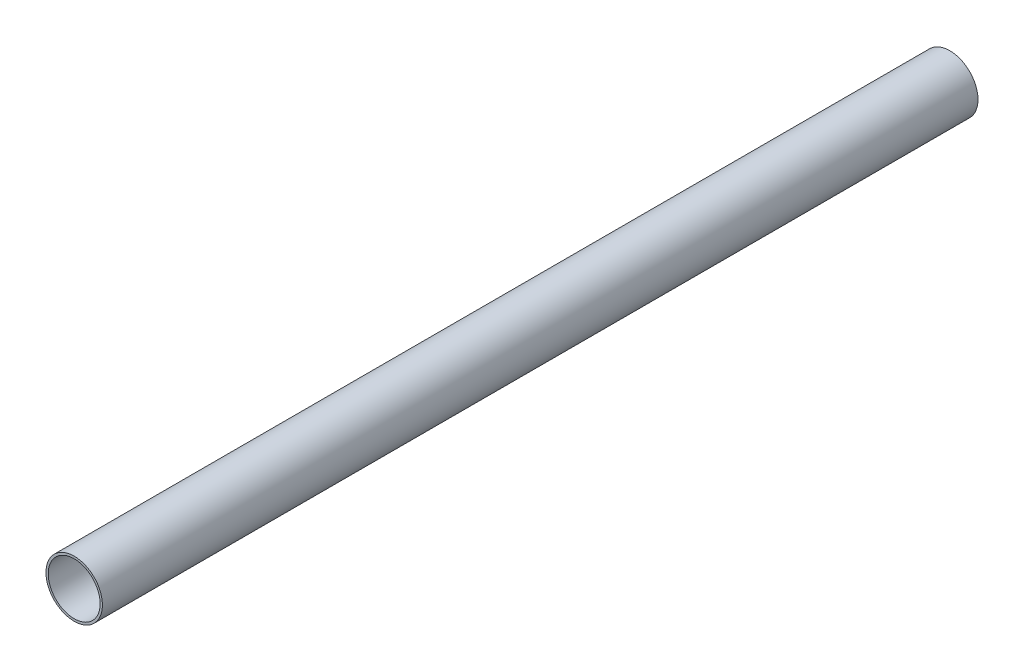
ISO-10303-21;
HEADER;
FILE_DESCRIPTION(('STEP AP214'),'2;1');
FILE_NAME('part.step','',(''),(''),'','','');
FILE_SCHEMA(('AUTOMOTIVE_DESIGN { 1 0 10303 214 1 1 1 1 }'));
ENDSEC;
DATA;
#1=APPLICATION_CONTEXT('core data for automotive mechanical design processes');
#2=APPLICATION_PROTOCOL_DEFINITION('international standard','automotive_design',2000,#1);
#3=PRODUCT_CONTEXT('',#1,'mechanical');
#4=PRODUCT('Part','Part','',(#3));
#5=PRODUCT_RELATED_PRODUCT_CATEGORY('part','',(#4));
#6=PRODUCT_DEFINITION_FORMATION('','',#4);
#7=PRODUCT_DEFINITION_CONTEXT('part definition',#1,'design');
#8=PRODUCT_DEFINITION('design','',#6,#7);
#9=PRODUCT_DEFINITION_SHAPE('','',#8);
#10=(LENGTH_UNIT() NAMED_UNIT(*) SI_UNIT(.MILLI.,.METRE.));
#11=(NAMED_UNIT(*) PLANE_ANGLE_UNIT() SI_UNIT($,.RADIAN.));
#12=(NAMED_UNIT(*) SI_UNIT($,.STERADIAN.) SOLID_ANGLE_UNIT());
#13=UNCERTAINTY_MEASURE_WITH_UNIT(LENGTH_MEASURE(1.E-05),#10,'distance_accuracy_value','');
#14=(GEOMETRIC_REPRESENTATION_CONTEXT(3) GLOBAL_UNCERTAINTY_ASSIGNED_CONTEXT((#13)) GLOBAL_UNIT_ASSIGNED_CONTEXT((#10,
#11,#12)) REPRESENTATION_CONTEXT('',''));
#15=CARTESIAN_POINT('',(0.,0.,0.));
#16=DIRECTION('',(0.,0.,1.));
#17=DIRECTION('',(1.,0.,0.));
#18=AXIS2_PLACEMENT_3D('',#15,#16,#17);
#19=CARTESIAN_POINT('',(0.,0.,387.62));
#20=DIRECTION('',(0.,0.,1.));
#21=DIRECTION('',(1.,0.,0.));
#22=AXIS2_PLACEMENT_3D('',#19,#20,#21);
#23=PLANE('',#22);
#24=CARTESIAN_POINT('',(0.,0.,387.62));
#25=DIRECTION('',(0.,0.,1.));
#26=DIRECTION('',(1.,0.,0.));
#27=AXIS2_PLACEMENT_3D('',#24,#25,#26);
#28=CIRCLE('',#27,12.5);
#29=CARTESIAN_POINT('',(12.5,0.,387.62));
#30=VERTEX_POINT('',#29);
#31=EDGE_CURVE('E10',#30,#30,#28,.T.);
#32=ORIENTED_EDGE('',*,*,#31,.T.);
#33=EDGE_LOOP('',(#32));
#34=FACE_BOUND('',#33,.T.);
#35=CARTESIAN_POINT('',(0.,0.,387.62));
#36=DIRECTION('',(0.,0.,1.));
#37=DIRECTION('',(1.,0.,0.));
#38=AXIS2_PLACEMENT_3D('',#35,#36,#37);
#39=CIRCLE('',#38,11.5);
#40=CARTESIAN_POINT('',(11.5,0.,387.62));
#41=VERTEX_POINT('',#40);
#42=EDGE_CURVE('E52',#41,#41,#39,.T.);
#43=ORIENTED_EDGE('',*,*,#42,.F.);
#44=EDGE_LOOP('',(#43));
#45=FACE_BOUND('',#44,.T.);
#46=ADVANCED_FACE('F38',(#34,#45),#23,.T.);
#47=CARTESIAN_POINT('',(0.,0.,0.));
#48=DIRECTION('',(0.,0.,1.));
#49=DIRECTION('',(1.,0.,0.));
#50=AXIS2_PLACEMENT_3D('',#47,#48,#49);
#51=PLANE('',#50);
#52=CARTESIAN_POINT('',(0.,0.,0.));
#53=DIRECTION('',(0.,0.,1.));
#54=DIRECTION('',(1.,0.,0.));
#55=AXIS2_PLACEMENT_3D('',#52,#53,#54);
#56=CIRCLE('',#55,12.5);
#57=CARTESIAN_POINT('',(12.5,0.,0.));
#58=VERTEX_POINT('',#57);
#59=EDGE_CURVE('E42',#58,#58,#56,.T.);
#60=ORIENTED_EDGE('',*,*,#59,.F.);
#61=EDGE_LOOP('',(#60));
#62=FACE_BOUND('',#61,.T.);
#63=CARTESIAN_POINT('',(0.,0.,0.));
#64=DIRECTION('',(0.,0.,1.));
#65=DIRECTION('',(1.,0.,0.));
#66=AXIS2_PLACEMENT_3D('',#63,#64,#65);
#67=CIRCLE('',#66,11.5);
#68=CARTESIAN_POINT('',(11.5,0.,0.));
#69=VERTEX_POINT('',#68);
#70=EDGE_CURVE('E54',#69,#69,#67,.T.);
#71=ORIENTED_EDGE('',*,*,#70,.T.);
#72=EDGE_LOOP('',(#71));
#73=FACE_BOUND('',#72,.T.);
#74=ADVANCED_FACE('F65',(#62,#73),#51,.F.);
#75=CARTESIAN_POINT('',(0.,0.,387.62));
#76=DIRECTION('',(0.,0.,-1.));
#77=DIRECTION('',(-1.,0.,0.));
#78=AXIS2_PLACEMENT_3D('',#75,#76,#77);
#79=CYLINDRICAL_SURFACE('',#78,12.5);
#80=ORIENTED_EDGE('',*,*,#31,.F.);
#81=EDGE_LOOP('',(#80));
#82=FACE_BOUND('',#81,.T.);
#83=ORIENTED_EDGE('',*,*,#59,.T.);
#84=EDGE_LOOP('',(#83));
#85=FACE_BOUND('',#84,.T.);
#86=ADVANCED_FACE('F40',(#82,#85),#79,.T.);
#87=CARTESIAN_POINT('',(0.,0.,387.62));
#88=DIRECTION('',(0.,0.,-1.));
#89=DIRECTION('',(-1.,0.,0.));
#90=AXIS2_PLACEMENT_3D('',#87,#88,#89);
#91=CYLINDRICAL_SURFACE('',#90,11.5);
#92=ORIENTED_EDGE('',*,*,#42,.T.);
#93=EDGE_LOOP('',(#92));
#94=FACE_BOUND('',#93,.T.);
#95=ORIENTED_EDGE('',*,*,#70,.F.);
#96=EDGE_LOOP('',(#95));
#97=FACE_BOUND('',#96,.T.);
#98=ADVANCED_FACE('F61',(#94,#97),#91,.F.);
#99=CLOSED_SHELL('',(#46,#74,#86,#98));
#100=MANIFOLD_SOLID_BREP('B2',#99);
#101=ADVANCED_BREP_SHAPE_REPRESENTATION('',(#18,#100),#14);
#102=SHAPE_DEFINITION_REPRESENTATION(#9,#101);
ENDSEC;
END-ISO-10303-21;
